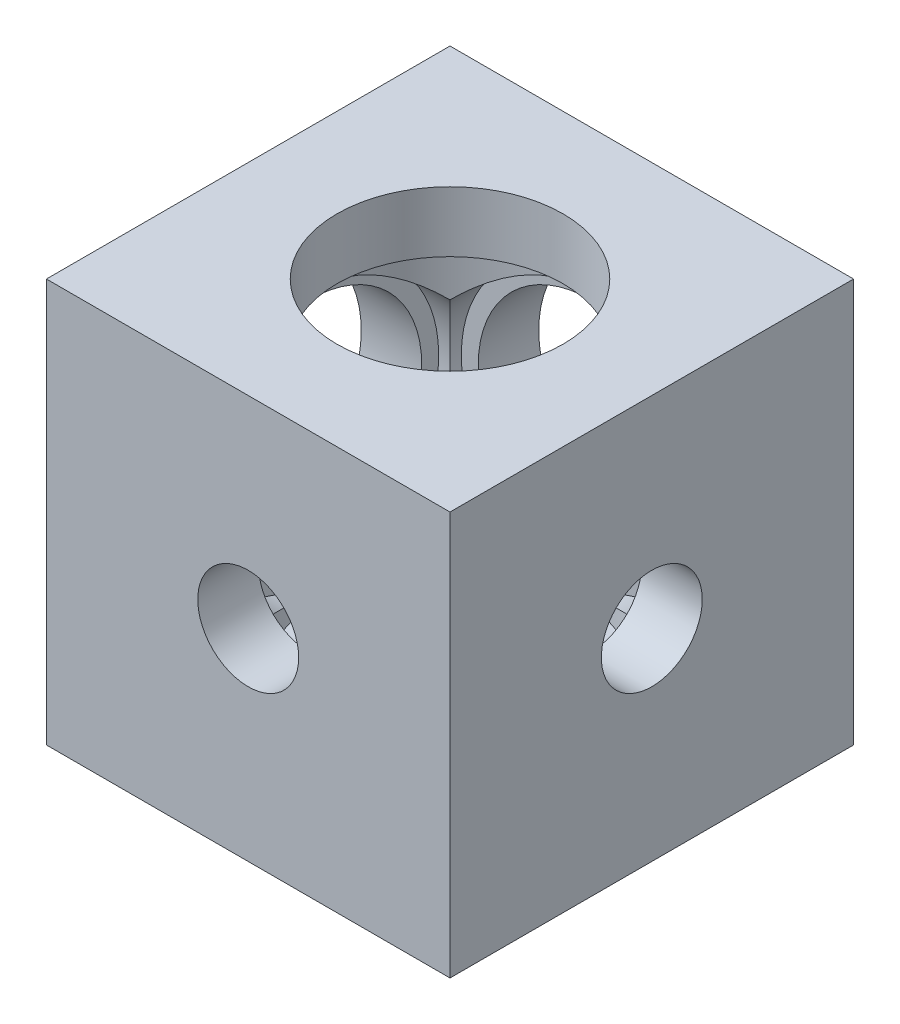
ISO-10303-21;
HEADER;
FILE_DESCRIPTION(('STEP AP214'),'2;1');
FILE_NAME('part.step','',(''),(''),'','','');
FILE_SCHEMA(('AUTOMOTIVE_DESIGN { 1 0 10303 214 1 1 1 1 }'));
ENDSEC;
DATA;
#1=APPLICATION_CONTEXT('core data for automotive mechanical design processes');
#2=APPLICATION_PROTOCOL_DEFINITION('international standard','automotive_design',2000,#1);
#3=PRODUCT_CONTEXT('',#1,'mechanical');
#4=PRODUCT('Part','Part','',(#3));
#5=PRODUCT_RELATED_PRODUCT_CATEGORY('part','',(#4));
#6=PRODUCT_DEFINITION_FORMATION('','',#4);
#7=PRODUCT_DEFINITION_CONTEXT('part definition',#1,'design');
#8=PRODUCT_DEFINITION('design','',#6,#7);
#9=PRODUCT_DEFINITION_SHAPE('','',#8);
#10=(LENGTH_UNIT() NAMED_UNIT(*) SI_UNIT(.MILLI.,.METRE.));
#11=(NAMED_UNIT(*) PLANE_ANGLE_UNIT() SI_UNIT($,.RADIAN.));
#12=(NAMED_UNIT(*) SI_UNIT($,.STERADIAN.) SOLID_ANGLE_UNIT());
#13=UNCERTAINTY_MEASURE_WITH_UNIT(LENGTH_MEASURE(1.E-05),#10,'distance_accuracy_value','');
#14=(GEOMETRIC_REPRESENTATION_CONTEXT(3) GLOBAL_UNCERTAINTY_ASSIGNED_CONTEXT((#13)) GLOBAL_UNIT_ASSIGNED_CONTEXT((#10,
#11,#12)) REPRESENTATION_CONTEXT('',''));
#15=CARTESIAN_POINT('',(0.,0.,0.));
#16=DIRECTION('',(0.,0.,1.));
#17=DIRECTION('',(1.,0.,0.));
#18=AXIS2_PLACEMENT_3D('',#15,#16,#17);
#19=CARTESIAN_POINT('',(0.,20.,0.));
#20=DIRECTION('',(0.,1.,0.));
#21=DIRECTION('',(0.,0.,1.));
#22=AXIS2_PLACEMENT_3D('',#19,#20,#21);
#23=CYLINDRICAL_SURFACE('',#22,6.4389);
#24=CARTESIAN_POINT('',(0.,10.,0.));
#25=DIRECTION('',(0.,0.707106781186548,-0.707106781186548));
#26=DIRECTION('',(0.,0.707106781186548,0.707106781186548));
#27=AXIS2_PLACEMENT_3D('',#24,#25,#26);
#28=ELLIPSE('',#27,9.10597970676411,6.4389);
#29=CARTESIAN_POINT('',(4.55298985338206,5.44701014661794,-4.55298985338206));
#30=VERTEX_POINT('',#29);
#31=CARTESIAN_POINT('',(-4.55298985338206,5.44701014661794,-4.55298985338206));
#32=VERTEX_POINT('',#31);
#33=EDGE_CURVE('E104',#30,#32,#28,.T.);
#34=ORIENTED_EDGE('',*,*,#33,.T.);
#35=CARTESIAN_POINT('',(0.,10.,0.));
#36=DIRECTION('',(-0.707106781186548,0.707106781186548,0.));
#37=DIRECTION('',(0.707106781186548,0.707106781186548,0.));
#38=AXIS2_PLACEMENT_3D('',#35,#36,#37);
#39=ELLIPSE('',#38,9.10597970676412,6.4389);
#40=CARTESIAN_POINT('',(-4.55298985338206,5.44701014661794,4.55298985338206));
#41=VERTEX_POINT('',#40);
#42=EDGE_CURVE('E139',#32,#41,#39,.T.);
#43=ORIENTED_EDGE('',*,*,#42,.T.);
#44=CARTESIAN_POINT('',(0.,10.,0.));
#45=DIRECTION('',(0.,0.707106781186548,0.707106781186548));
#46=DIRECTION('',(0.,0.707106781186548,-0.707106781186548));
#47=AXIS2_PLACEMENT_3D('',#44,#45,#46);
#48=ELLIPSE('',#47,9.10597970676411,6.4389);
#49=CARTESIAN_POINT('',(4.55298985338206,5.44701014661794,4.55298985338206));
#50=VERTEX_POINT('',#49);
#51=EDGE_CURVE('E98',#41,#50,#48,.T.);
#52=ORIENTED_EDGE('',*,*,#51,.T.);
#53=CARTESIAN_POINT('',(0.,10.,0.));
#54=DIRECTION('',(0.707106781186548,0.707106781186548,0.));
#55=DIRECTION('',(-0.707106781186548,0.707106781186548,0.));
#56=AXIS2_PLACEMENT_3D('',#53,#54,#55);
#57=ELLIPSE('',#56,9.10597970676412,6.4389);
#58=EDGE_CURVE('E32',#50,#30,#57,.T.);
#59=ORIENTED_EDGE('',*,*,#58,.T.);
#60=EDGE_LOOP('',(#34,#43,#52,#59));
#61=FACE_BOUND('',#60,.T.);
#62=CARTESIAN_POINT('',(0.,3.,0.));
#63=DIRECTION('',(0.,-1.,0.));
#64=DIRECTION('',(0.,0.,-1.));
#65=AXIS2_PLACEMENT_3D('',#62,#63,#64);
#66=CIRCLE('',#65,6.4389);
#67=CARTESIAN_POINT('',(0.,3.,-6.4389));
#68=VERTEX_POINT('',#67);
#69=EDGE_CURVE('E11',#68,#68,#66,.F.);
#70=ORIENTED_EDGE('',*,*,#69,.F.);
#71=EDGE_LOOP('',(#70));
#72=FACE_BOUND('',#71,.T.);
#73=ADVANCED_FACE('F17',(#61,#72),#23,.F.);
#74=CARTESIAN_POINT('',(-10.,10.,0.));
#75=DIRECTION('',(-1.,0.,0.));
#76=DIRECTION('',(0.,0.,1.));
#77=AXIS2_PLACEMENT_3D('',#74,#75,#76);
#78=CYLINDRICAL_SURFACE('',#77,6.4389);
#79=ORIENTED_EDGE('',*,*,#58,.F.);
#80=CARTESIAN_POINT('',(0.,10.,0.));
#81=DIRECTION('',(0.707106781186548,0.,-0.707106781186548));
#82=DIRECTION('',(-0.707106781186548,0.,-0.707106781186548));
#83=AXIS2_PLACEMENT_3D('',#80,#81,#82);
#84=ELLIPSE('',#83,9.10597970676412,6.4389);
#85=CARTESIAN_POINT('',(4.55298985338206,14.5529898533821,4.55298985338206));
#86=VERTEX_POINT('',#85);
#87=EDGE_CURVE('E140',#86,#50,#84,.T.);
#88=ORIENTED_EDGE('',*,*,#87,.F.);
#89=CARTESIAN_POINT('',(0.,10.,0.));
#90=DIRECTION('',(-0.707106781186548,0.707106781186548,0.));
#91=DIRECTION('',(0.707106781186548,0.707106781186548,0.));
#92=AXIS2_PLACEMENT_3D('',#89,#90,#91);
#93=ELLIPSE('',#92,9.10597970676412,6.4389);
#94=CARTESIAN_POINT('',(4.55298985338206,14.5529898533821,-4.55298985338206));
#95=VERTEX_POINT('',#94);
#96=EDGE_CURVE('E89',#95,#86,#93,.F.);
#97=ORIENTED_EDGE('',*,*,#96,.F.);
#98=CARTESIAN_POINT('',(0.,10.,0.));
#99=DIRECTION('',(-0.707106781186548,0.,-0.707106781186548));
#100=DIRECTION('',(0.707106781186548,0.,-0.707106781186548));
#101=AXIS2_PLACEMENT_3D('',#98,#99,#100);
#102=ELLIPSE('',#101,9.10597970676412,6.4389);
#103=EDGE_CURVE('E146',#30,#95,#102,.F.);
#104=ORIENTED_EDGE('',*,*,#103,.F.);
#105=EDGE_LOOP('',(#79,#88,#97,#104));
#106=FACE_BOUND('',#105,.T.);
#107=CARTESIAN_POINT('',(7.,10.,0.));
#108=DIRECTION('',(1.,0.,0.));
#109=DIRECTION('',(0.,0.,-1.));
#110=AXIS2_PLACEMENT_3D('',#107,#108,#109);
#111=CIRCLE('',#110,6.4389);
#112=CARTESIAN_POINT('',(7.,10.,-6.4389));
#113=VERTEX_POINT('',#112);
#114=EDGE_CURVE('E25',#113,#113,#111,.F.);
#115=ORIENTED_EDGE('',*,*,#114,.F.);
#116=EDGE_LOOP('',(#115));
#117=FACE_BOUND('',#116,.T.);
#118=ADVANCED_FACE('F226',(#106,#117),#78,.F.);
#119=CARTESIAN_POINT('',(0.,10.,-10.));
#120=DIRECTION('',(0.,0.,-1.));
#121=DIRECTION('',(-1.,0.,0.));
#122=AXIS2_PLACEMENT_3D('',#119,#120,#121);
#123=CYLINDRICAL_SURFACE('',#122,6.4389);
#124=ORIENTED_EDGE('',*,*,#51,.F.);
#125=CARTESIAN_POINT('',(0.,10.,0.));
#126=DIRECTION('',(-0.707106781186548,0.,-0.707106781186548));
#127=DIRECTION('',(0.707106781186548,0.,-0.707106781186548));
#128=AXIS2_PLACEMENT_3D('',#125,#126,#127);
#129=ELLIPSE('',#128,9.10597970676412,6.4389);
#130=CARTESIAN_POINT('',(-4.55298985338206,14.5529898533821,4.55298985338206));
#131=VERTEX_POINT('',#130);
#132=EDGE_CURVE('E83',#41,#131,#129,.T.);
#133=ORIENTED_EDGE('',*,*,#132,.T.);
#134=CARTESIAN_POINT('',(0.,10.,0.));
#135=DIRECTION('',(0.,0.707106781186548,-0.707106781186548));
#136=DIRECTION('',(0.,0.707106781186548,0.707106781186548));
#137=AXIS2_PLACEMENT_3D('',#134,#135,#136);
#138=ELLIPSE('',#137,9.10597970676411,6.4389);
#139=EDGE_CURVE('E90',#86,#131,#138,.F.);
#140=ORIENTED_EDGE('',*,*,#139,.F.);
#141=ORIENTED_EDGE('',*,*,#87,.T.);
#142=EDGE_LOOP('',(#124,#133,#140,#141));
#143=FACE_BOUND('',#142,.T.);
#144=CARTESIAN_POINT('',(0.,10.,7.));
#145=DIRECTION('',(0.,0.,1.));
#146=DIRECTION('',(1.,0.,0.));
#147=AXIS2_PLACEMENT_3D('',#144,#145,#146);
#148=CIRCLE('',#147,6.4389);
#149=CARTESIAN_POINT('',(6.4389,10.,7.));
#150=VERTEX_POINT('',#149);
#151=EDGE_CURVE('E460',#150,#150,#148,.F.);
#152=ORIENTED_EDGE('',*,*,#151,.F.);
#153=EDGE_LOOP('',(#152));
#154=FACE_BOUND('',#153,.T.);
#155=ADVANCED_FACE('F95',(#143,#154),#123,.F.);
#156=CARTESIAN_POINT('',(0.,10.,0.));
#157=DIRECTION('',(0.,0.707106781186548,0.707106781186548));
#158=DIRECTION('',(0.,0.707106781186548,-0.707106781186548));
#159=AXIS2_PLACEMENT_3D('',#156,#157,#158);
#160=ELLIPSE('',#159,9.10597970676411,6.4389);
#161=CARTESIAN_POINT('',(-4.55298985338206,14.5529898533821,-4.55298985338206));
#162=VERTEX_POINT('',#161);
#163=EDGE_CURVE('E135',#162,#95,#160,.F.);
#164=ORIENTED_EDGE('',*,*,#163,.T.);
#165=ORIENTED_EDGE('',*,*,#96,.T.);
#166=ORIENTED_EDGE('',*,*,#139,.T.);
#167=CARTESIAN_POINT('',(0.,10.,0.));
#168=DIRECTION('',(0.707106781186548,0.707106781186548,0.));
#169=DIRECTION('',(-0.707106781186548,0.707106781186548,0.));
#170=AXIS2_PLACEMENT_3D('',#167,#168,#169);
#171=ELLIPSE('',#170,9.10597970676412,6.4389);
#172=EDGE_CURVE('E79',#131,#162,#171,.F.);
#173=ORIENTED_EDGE('',*,*,#172,.T.);
#174=EDGE_LOOP('',(#164,#165,#166,#173));
#175=FACE_BOUND('',#174,.T.);
#176=CARTESIAN_POINT('',(0.,17.,0.));
#177=DIRECTION('',(0.,1.,0.));
#178=DIRECTION('',(0.,0.,1.));
#179=AXIS2_PLACEMENT_3D('',#176,#177,#178);
#180=CIRCLE('',#179,6.4389);
#181=CARTESIAN_POINT('',(0.,17.,6.4389));
#182=VERTEX_POINT('',#181);
#183=EDGE_CURVE('E461',#182,#182,#180,.F.);
#184=ORIENTED_EDGE('',*,*,#183,.F.);
#185=EDGE_LOOP('',(#184));
#186=FACE_BOUND('',#185,.T.);
#187=ADVANCED_FACE('F102',(#175,#186),#23,.F.);
#188=ORIENTED_EDGE('',*,*,#33,.F.);
#189=ORIENTED_EDGE('',*,*,#103,.T.);
#190=ORIENTED_EDGE('',*,*,#163,.F.);
#191=CARTESIAN_POINT('',(0.,10.,0.));
#192=DIRECTION('',(0.707106781186548,0.,-0.707106781186548));
#193=DIRECTION('',(-0.707106781186548,0.,-0.707106781186548));
#194=AXIS2_PLACEMENT_3D('',#191,#192,#193);
#195=ELLIPSE('',#194,9.10597970676412,6.4389);
#196=EDGE_CURVE('E40',#162,#32,#195,.F.);
#197=ORIENTED_EDGE('',*,*,#196,.T.);
#198=EDGE_LOOP('',(#188,#189,#190,#197));
#199=FACE_BOUND('',#198,.T.);
#200=CARTESIAN_POINT('',(0.,10.,-7.));
#201=DIRECTION('',(0.,0.,-1.));
#202=DIRECTION('',(-1.,0.,0.));
#203=AXIS2_PLACEMENT_3D('',#200,#201,#202);
#204=CIRCLE('',#203,6.4389);
#205=CARTESIAN_POINT('',(-6.4389,10.,-7.));
#206=VERTEX_POINT('',#205);
#207=EDGE_CURVE('E465',#206,#206,#204,.F.);
#208=ORIENTED_EDGE('',*,*,#207,.F.);
#209=EDGE_LOOP('',(#208));
#210=FACE_BOUND('',#209,.T.);
#211=ADVANCED_FACE('F235',(#199,#210),#123,.F.);
#212=ORIENTED_EDGE('',*,*,#196,.F.);
#213=ORIENTED_EDGE('',*,*,#172,.F.);
#214=ORIENTED_EDGE('',*,*,#132,.F.);
#215=ORIENTED_EDGE('',*,*,#42,.F.);
#216=EDGE_LOOP('',(#212,#213,#214,#215));
#217=FACE_BOUND('',#216,.T.);
#218=CARTESIAN_POINT('',(-7.,10.,0.));
#219=DIRECTION('',(-1.,0.,0.));
#220=DIRECTION('',(0.,0.,1.));
#221=AXIS2_PLACEMENT_3D('',#218,#219,#220);
#222=CIRCLE('',#221,6.4389);
#223=CARTESIAN_POINT('',(-7.,10.,6.4389));
#224=VERTEX_POINT('',#223);
#225=EDGE_CURVE('E111',#224,#224,#222,.F.);
#226=ORIENTED_EDGE('',*,*,#225,.F.);
#227=EDGE_LOOP('',(#226));
#228=FACE_BOUND('',#227,.T.);
#229=ADVANCED_FACE('F81',(#217,#228),#78,.F.);
#230=CARTESIAN_POINT('',(10.,20.,-10.));
#231=DIRECTION('',(-1.,0.,0.));
#232=DIRECTION('',(0.,0.,1.));
#233=AXIS2_PLACEMENT_3D('',#230,#231,#232);
#234=PLANE('',#233);
#235=DIRECTION('',(0.,0.,-1.));
#236=VECTOR('',#235,1.);
#237=CARTESIAN_POINT('',(10.,0.,-10.));
#238=LINE('',#237,#236);
#239=CARTESIAN_POINT('',(10.,0.,10.));
#240=VERTEX_POINT('',#239);
#241=CARTESIAN_POINT('',(10.,0.,-10.));
#242=VERTEX_POINT('',#241);
#243=EDGE_CURVE('E149',#240,#242,#238,.T.);
#244=ORIENTED_EDGE('',*,*,#243,.T.);
#245=DIRECTION('',(0.,-1.,0.));
#246=VECTOR('',#245,1.);
#247=CARTESIAN_POINT('',(10.,20.,-10.));
#248=LINE('',#247,#246);
#249=CARTESIAN_POINT('',(10.,20.,-10.));
#250=VERTEX_POINT('',#249);
#251=EDGE_CURVE('E132',#250,#242,#248,.T.);
#252=ORIENTED_EDGE('',*,*,#251,.F.);
#253=DIRECTION('',(0.,0.,-1.));
#254=VECTOR('',#253,1.);
#255=CARTESIAN_POINT('',(10.,20.,-10.));
#256=LINE('',#255,#254);
#257=CARTESIAN_POINT('',(10.,20.,10.));
#258=VERTEX_POINT('',#257);
#259=EDGE_CURVE('E115',#258,#250,#256,.T.);
#260=ORIENTED_EDGE('',*,*,#259,.F.);
#261=DIRECTION('',(0.,-1.,0.));
#262=VECTOR('',#261,1.);
#263=CARTESIAN_POINT('',(10.,20.,10.));
#264=LINE('',#263,#262);
#265=EDGE_CURVE('E122',#258,#240,#264,.T.);
#266=ORIENTED_EDGE('',*,*,#265,.T.);
#267=EDGE_LOOP('',(#244,#252,#260,#266));
#268=FACE_BOUND('',#267,.T.);
#269=CARTESIAN_POINT('',(10.,10.,0.));
#270=DIRECTION('',(1.,0.,0.));
#271=DIRECTION('',(0.,0.,-1.));
#272=AXIS2_PLACEMENT_3D('',#269,#270,#271);
#273=CIRCLE('',#272,2.5);
#274=CARTESIAN_POINT('',(10.,10.,-2.5));
#275=VERTEX_POINT('',#274);
#276=EDGE_CURVE('E297',#275,#275,#273,.T.);
#277=ORIENTED_EDGE('',*,*,#276,.F.);
#278=EDGE_LOOP('',(#277));
#279=FACE_BOUND('',#278,.T.);
#280=ADVANCED_FACE('F19',(#268,#279),#234,.F.);
#281=CARTESIAN_POINT('',(-10.,20.,10.));
#282=DIRECTION('',(0.,0.,-1.));
#283=DIRECTION('',(-1.,0.,0.));
#284=AXIS2_PLACEMENT_3D('',#281,#282,#283);
#285=PLANE('',#284);
#286=DIRECTION('',(1.,0.,0.));
#287=VECTOR('',#286,1.);
#288=CARTESIAN_POINT('',(-10.,0.,10.));
#289=LINE('',#288,#287);
#290=CARTESIAN_POINT('',(-10.,0.,10.));
#291=VERTEX_POINT('',#290);
#292=EDGE_CURVE('E112',#291,#240,#289,.T.);
#293=ORIENTED_EDGE('',*,*,#292,.T.);
#294=ORIENTED_EDGE('',*,*,#265,.F.);
#295=DIRECTION('',(1.,0.,0.));
#296=VECTOR('',#295,1.);
#297=CARTESIAN_POINT('',(-10.,20.,10.));
#298=LINE('',#297,#296);
#299=CARTESIAN_POINT('',(-10.,20.,10.));
#300=VERTEX_POINT('',#299);
#301=EDGE_CURVE('E126',#300,#258,#298,.T.);
#302=ORIENTED_EDGE('',*,*,#301,.F.);
#303=DIRECTION('',(0.,-1.,0.));
#304=VECTOR('',#303,1.);
#305=CARTESIAN_POINT('',(-10.,20.,10.));
#306=LINE('',#305,#304);
#307=EDGE_CURVE('E125',#300,#291,#306,.T.);
#308=ORIENTED_EDGE('',*,*,#307,.T.);
#309=EDGE_LOOP('',(#293,#294,#302,#308));
#310=FACE_BOUND('',#309,.T.);
#311=CARTESIAN_POINT('',(0.,10.,10.));
#312=DIRECTION('',(0.,0.,1.));
#313=DIRECTION('',(1.,0.,0.));
#314=AXIS2_PLACEMENT_3D('',#311,#312,#313);
#315=CIRCLE('',#314,2.5);
#316=CARTESIAN_POINT('',(2.5,10.,10.));
#317=VERTEX_POINT('',#316);
#318=EDGE_CURVE('E303',#317,#317,#315,.T.);
#319=ORIENTED_EDGE('',*,*,#318,.F.);
#320=EDGE_LOOP('',(#319));
#321=FACE_BOUND('',#320,.T.);
#322=ADVANCED_FACE('F171',(#310,#321),#285,.F.);
#323=CARTESIAN_POINT('',(0.,0.,0.));
#324=DIRECTION('',(0.,1.,0.));
#325=DIRECTION('',(0.,0.,1.));
#326=AXIS2_PLACEMENT_3D('',#323,#324,#325);
#327=PLANE('',#326);
#328=DIRECTION('',(-1.,0.,0.));
#329=VECTOR('',#328,1.);
#330=CARTESIAN_POINT('',(-10.,0.,-10.));
#331=LINE('',#330,#329);
#332=CARTESIAN_POINT('',(-10.,0.,-10.));
#333=VERTEX_POINT('',#332);
#334=EDGE_CURVE('E157',#242,#333,#331,.T.);
#335=ORIENTED_EDGE('',*,*,#334,.F.);
#336=ORIENTED_EDGE('',*,*,#243,.F.);
#337=ORIENTED_EDGE('',*,*,#292,.F.);
#338=DIRECTION('',(0.,0.,1.));
#339=VECTOR('',#338,1.);
#340=CARTESIAN_POINT('',(-10.,0.,-10.));
#341=LINE('',#340,#339);
#342=EDGE_CURVE('E116',#333,#291,#341,.T.);
#343=ORIENTED_EDGE('',*,*,#342,.F.);
#344=EDGE_LOOP('',(#335,#336,#337,#343));
#345=FACE_BOUND('',#344,.T.);
#346=CARTESIAN_POINT('',(0.,0.,0.));
#347=DIRECTION('',(0.,-1.,0.));
#348=DIRECTION('',(0.,0.,-1.));
#349=AXIS2_PLACEMENT_3D('',#346,#347,#348);
#350=CIRCLE('',#349,2.5);
#351=CARTESIAN_POINT('',(0.,0.,-2.5));
#352=VERTEX_POINT('',#351);
#353=EDGE_CURVE('E295',#352,#352,#350,.T.);
#354=ORIENTED_EDGE('',*,*,#353,.F.);
#355=EDGE_LOOP('',(#354));
#356=FACE_BOUND('',#355,.T.);
#357=ADVANCED_FACE('F175',(#345,#356),#327,.F.);
#358=CARTESIAN_POINT('',(-10.,20.,-10.));
#359=DIRECTION('',(0.,0.,1.));
#360=DIRECTION('',(1.,0.,0.));
#361=AXIS2_PLACEMENT_3D('',#358,#359,#360);
#362=PLANE('',#361);
#363=ORIENTED_EDGE('',*,*,#334,.T.);
#364=DIRECTION('',(0.,-1.,0.));
#365=VECTOR('',#364,1.);
#366=CARTESIAN_POINT('',(-10.,20.,-10.));
#367=LINE('',#366,#365);
#368=CARTESIAN_POINT('',(-10.,20.,-10.));
#369=VERTEX_POINT('',#368);
#370=EDGE_CURVE('E129',#369,#333,#367,.T.);
#371=ORIENTED_EDGE('',*,*,#370,.F.);
#372=DIRECTION('',(-1.,0.,0.));
#373=VECTOR('',#372,1.);
#374=CARTESIAN_POINT('',(-10.,20.,-10.));
#375=LINE('',#374,#373);
#376=EDGE_CURVE('E152',#250,#369,#375,.T.);
#377=ORIENTED_EDGE('',*,*,#376,.F.);
#378=ORIENTED_EDGE('',*,*,#251,.T.);
#379=EDGE_LOOP('',(#363,#371,#377,#378));
#380=FACE_BOUND('',#379,.T.);
#381=CARTESIAN_POINT('',(0.,10.,-10.));
#382=DIRECTION('',(0.,0.,-1.));
#383=DIRECTION('',(-1.,0.,0.));
#384=AXIS2_PLACEMENT_3D('',#381,#382,#383);
#385=CIRCLE('',#384,5.6);
#386=CARTESIAN_POINT('',(-5.6,10.,-10.));
#387=VERTEX_POINT('',#386);
#388=EDGE_CURVE('E189',#387,#387,#385,.T.);
#389=ORIENTED_EDGE('',*,*,#388,.F.);
#390=EDGE_LOOP('',(#389));
#391=FACE_BOUND('',#390,.T.);
#392=ADVANCED_FACE('F184',(#380,#391),#362,.F.);
#393=CARTESIAN_POINT('',(-10.,20.,-10.));
#394=DIRECTION('',(1.,0.,0.));
#395=DIRECTION('',(0.,0.,-1.));
#396=AXIS2_PLACEMENT_3D('',#393,#394,#395);
#397=PLANE('',#396);
#398=ORIENTED_EDGE('',*,*,#342,.T.);
#399=ORIENTED_EDGE('',*,*,#307,.F.);
#400=DIRECTION('',(0.,0.,1.));
#401=VECTOR('',#400,1.);
#402=CARTESIAN_POINT('',(-10.,20.,-10.));
#403=LINE('',#402,#401);
#404=EDGE_CURVE('E154',#369,#300,#403,.T.);
#405=ORIENTED_EDGE('',*,*,#404,.F.);
#406=ORIENTED_EDGE('',*,*,#370,.T.);
#407=EDGE_LOOP('',(#398,#399,#405,#406));
#408=FACE_BOUND('',#407,.T.);
#409=CARTESIAN_POINT('',(-10.,10.,0.));
#410=DIRECTION('',(-1.,0.,0.));
#411=DIRECTION('',(0.,0.,1.));
#412=AXIS2_PLACEMENT_3D('',#409,#410,#411);
#413=CIRCLE('',#412,5.6);
#414=CARTESIAN_POINT('',(-10.,10.,5.6));
#415=VERTEX_POINT('',#414);
#416=EDGE_CURVE('E99',#415,#415,#413,.T.);
#417=ORIENTED_EDGE('',*,*,#416,.F.);
#418=EDGE_LOOP('',(#417));
#419=FACE_BOUND('',#418,.T.);
#420=ADVANCED_FACE('F164',(#408,#419),#397,.F.);
#421=CARTESIAN_POINT('',(0.,20.,0.));
#422=DIRECTION('',(0.,1.,0.));
#423=DIRECTION('',(0.,0.,1.));
#424=AXIS2_PLACEMENT_3D('',#421,#422,#423);
#425=PLANE('',#424);
#426=ORIENTED_EDGE('',*,*,#259,.T.);
#427=ORIENTED_EDGE('',*,*,#376,.T.);
#428=ORIENTED_EDGE('',*,*,#404,.T.);
#429=ORIENTED_EDGE('',*,*,#301,.T.);
#430=EDGE_LOOP('',(#426,#427,#428,#429));
#431=FACE_BOUND('',#430,.T.);
#432=CARTESIAN_POINT('',(0.,20.,0.));
#433=DIRECTION('',(0.,1.,0.));
#434=DIRECTION('',(0.,0.,1.));
#435=AXIS2_PLACEMENT_3D('',#432,#433,#434);
#436=CIRCLE('',#435,5.6);
#437=CARTESIAN_POINT('',(0.,20.,5.6));
#438=VERTEX_POINT('',#437);
#439=EDGE_CURVE('E198',#438,#438,#436,.T.);
#440=ORIENTED_EDGE('',*,*,#439,.F.);
#441=EDGE_LOOP('',(#440));
#442=FACE_BOUND('',#441,.T.);
#443=ADVANCED_FACE('F182',(#431,#442),#425,.T.);
#444=CARTESIAN_POINT('',(-7.,10.,0.));
#445=DIRECTION('',(-1.,0.,0.));
#446=DIRECTION('',(0.,0.,1.));
#447=AXIS2_PLACEMENT_3D('',#444,#445,#446);
#448=PLANE('',#447);
#449=CARTESIAN_POINT('',(-7.,10.,0.));
#450=DIRECTION('',(-1.,0.,0.));
#451=DIRECTION('',(0.,0.,1.));
#452=AXIS2_PLACEMENT_3D('',#449,#450,#451);
#453=CIRCLE('',#452,5.6);
#454=CARTESIAN_POINT('',(-7.,10.,5.6));
#455=VERTEX_POINT('',#454);
#456=EDGE_CURVE('E195',#455,#455,#453,.T.);
#457=ORIENTED_EDGE('',*,*,#456,.T.);
#458=EDGE_LOOP('',(#457));
#459=FACE_BOUND('',#458,.T.);
#460=ORIENTED_EDGE('',*,*,#225,.T.);
#461=EDGE_LOOP('',(#460));
#462=FACE_BOUND('',#461,.T.);
#463=ADVANCED_FACE('F207',(#459,#462),#448,.F.);
#464=CARTESIAN_POINT('',(-7.,10.,0.));
#465=DIRECTION('',(-1.,0.,0.));
#466=DIRECTION('',(0.,0.,1.));
#467=AXIS2_PLACEMENT_3D('',#464,#465,#466);
#468=CYLINDRICAL_SURFACE('',#467,5.6);
#469=ORIENTED_EDGE('',*,*,#456,.F.);
#470=EDGE_LOOP('',(#469));
#471=FACE_BOUND('',#470,.T.);
#472=ORIENTED_EDGE('',*,*,#416,.T.);
#473=EDGE_LOOP('',(#472));
#474=FACE_BOUND('',#473,.T.);
#475=ADVANCED_FACE('F210',(#471,#474),#468,.F.);
#476=CARTESIAN_POINT('',(0.,10.,-7.));
#477=DIRECTION('',(0.,0.,-1.));
#478=DIRECTION('',(-1.,0.,0.));
#479=AXIS2_PLACEMENT_3D('',#476,#477,#478);
#480=PLANE('',#479);
#481=CARTESIAN_POINT('',(0.,10.,-7.));
#482=DIRECTION('',(0.,0.,-1.));
#483=DIRECTION('',(-1.,0.,0.));
#484=AXIS2_PLACEMENT_3D('',#481,#482,#483);
#485=CIRCLE('',#484,5.6);
#486=CARTESIAN_POINT('',(-5.6,10.,-7.));
#487=VERTEX_POINT('',#486);
#488=EDGE_CURVE('E191',#487,#487,#485,.T.);
#489=ORIENTED_EDGE('',*,*,#488,.T.);
#490=EDGE_LOOP('',(#489));
#491=FACE_BOUND('',#490,.T.);
#492=ORIENTED_EDGE('',*,*,#207,.T.);
#493=EDGE_LOOP('',(#492));
#494=FACE_BOUND('',#493,.T.);
#495=ADVANCED_FACE('F213',(#491,#494),#480,.F.);
#496=CARTESIAN_POINT('',(0.,10.,-7.));
#497=DIRECTION('',(0.,0.,-1.));
#498=DIRECTION('',(-1.,0.,0.));
#499=AXIS2_PLACEMENT_3D('',#496,#497,#498);
#500=CYLINDRICAL_SURFACE('',#499,5.6);
#501=ORIENTED_EDGE('',*,*,#488,.F.);
#502=EDGE_LOOP('',(#501));
#503=FACE_BOUND('',#502,.T.);
#504=ORIENTED_EDGE('',*,*,#388,.T.);
#505=EDGE_LOOP('',(#504));
#506=FACE_BOUND('',#505,.T.);
#507=ADVANCED_FACE('F250',(#503,#506),#500,.F.);
#508=CARTESIAN_POINT('',(0.,17.,0.));
#509=DIRECTION('',(0.,1.,0.));
#510=DIRECTION('',(0.,0.,1.));
#511=AXIS2_PLACEMENT_3D('',#508,#509,#510);
#512=PLANE('',#511);
#513=CARTESIAN_POINT('',(0.,17.,0.));
#514=DIRECTION('',(0.,1.,0.));
#515=DIRECTION('',(0.,0.,1.));
#516=AXIS2_PLACEMENT_3D('',#513,#514,#515);
#517=CIRCLE('',#516,5.6);
#518=CARTESIAN_POINT('',(0.,17.,5.6));
#519=VERTEX_POINT('',#518);
#520=EDGE_CURVE('E192',#519,#519,#517,.T.);
#521=ORIENTED_EDGE('',*,*,#520,.T.);
#522=EDGE_LOOP('',(#521));
#523=FACE_BOUND('',#522,.T.);
#524=ORIENTED_EDGE('',*,*,#183,.T.);
#525=EDGE_LOOP('',(#524));
#526=FACE_BOUND('',#525,.T.);
#527=ADVANCED_FACE('F254',(#523,#526),#512,.F.);
#528=CARTESIAN_POINT('',(0.,17.,0.));
#529=DIRECTION('',(0.,1.,0.));
#530=DIRECTION('',(0.,0.,1.));
#531=AXIS2_PLACEMENT_3D('',#528,#529,#530);
#532=CYLINDRICAL_SURFACE('',#531,5.6);
#533=ORIENTED_EDGE('',*,*,#520,.F.);
#534=EDGE_LOOP('',(#533));
#535=FACE_BOUND('',#534,.T.);
#536=ORIENTED_EDGE('',*,*,#439,.T.);
#537=EDGE_LOOP('',(#536));
#538=FACE_BOUND('',#537,.T.);
#539=ADVANCED_FACE('F258',(#535,#538),#532,.F.);
#540=CARTESIAN_POINT('',(0.,10.,7.));
#541=DIRECTION('',(0.,0.,1.));
#542=DIRECTION('',(1.,0.,0.));
#543=AXIS2_PLACEMENT_3D('',#540,#541,#542);
#544=PLANE('',#543);
#545=CARTESIAN_POINT('',(0.,10.,7.));
#546=DIRECTION('',(0.,0.,1.));
#547=DIRECTION('',(1.,0.,0.));
#548=AXIS2_PLACEMENT_3D('',#545,#546,#547);
#549=CIRCLE('',#548,2.5);
#550=CARTESIAN_POINT('',(2.5,10.,7.));
#551=VERTEX_POINT('',#550);
#552=EDGE_CURVE('E306',#551,#551,#549,.T.);
#553=ORIENTED_EDGE('',*,*,#552,.T.);
#554=EDGE_LOOP('',(#553));
#555=FACE_BOUND('',#554,.T.);
#556=ORIENTED_EDGE('',*,*,#151,.T.);
#557=EDGE_LOOP('',(#556));
#558=FACE_BOUND('',#557,.T.);
#559=ADVANCED_FACE('F262',(#555,#558),#544,.F.);
#560=CARTESIAN_POINT('',(0.,10.,7.));
#561=DIRECTION('',(0.,0.,1.));
#562=DIRECTION('',(1.,0.,0.));
#563=AXIS2_PLACEMENT_3D('',#560,#561,#562);
#564=CYLINDRICAL_SURFACE('',#563,2.5);
#565=ORIENTED_EDGE('',*,*,#552,.F.);
#566=EDGE_LOOP('',(#565));
#567=FACE_BOUND('',#566,.T.);
#568=ORIENTED_EDGE('',*,*,#318,.T.);
#569=EDGE_LOOP('',(#568));
#570=FACE_BOUND('',#569,.T.);
#571=ADVANCED_FACE('F266',(#567,#570),#564,.F.);
#572=CARTESIAN_POINT('',(7.,10.,0.));
#573=DIRECTION('',(1.,0.,0.));
#574=DIRECTION('',(0.,0.,-1.));
#575=AXIS2_PLACEMENT_3D('',#572,#573,#574);
#576=PLANE('',#575);
#577=CARTESIAN_POINT('',(7.,10.,0.));
#578=DIRECTION('',(1.,0.,0.));
#579=DIRECTION('',(0.,0.,-1.));
#580=AXIS2_PLACEMENT_3D('',#577,#578,#579);
#581=CIRCLE('',#580,2.5);
#582=CARTESIAN_POINT('',(7.,10.,-2.5));
#583=VERTEX_POINT('',#582);
#584=EDGE_CURVE('E300',#583,#583,#581,.T.);
#585=ORIENTED_EDGE('',*,*,#584,.T.);
#586=EDGE_LOOP('',(#585));
#587=FACE_BOUND('',#586,.T.);
#588=ORIENTED_EDGE('',*,*,#114,.T.);
#589=EDGE_LOOP('',(#588));
#590=FACE_BOUND('',#589,.T.);
#591=ADVANCED_FACE('F270',(#587,#590),#576,.F.);
#592=CARTESIAN_POINT('',(7.,10.,0.));
#593=DIRECTION('',(1.,0.,0.));
#594=DIRECTION('',(0.,0.,-1.));
#595=AXIS2_PLACEMENT_3D('',#592,#593,#594);
#596=CYLINDRICAL_SURFACE('',#595,2.5);
#597=ORIENTED_EDGE('',*,*,#584,.F.);
#598=EDGE_LOOP('',(#597));
#599=FACE_BOUND('',#598,.T.);
#600=ORIENTED_EDGE('',*,*,#276,.T.);
#601=EDGE_LOOP('',(#600));
#602=FACE_BOUND('',#601,.T.);
#603=ADVANCED_FACE('F274',(#599,#602),#596,.F.);
#604=CARTESIAN_POINT('',(0.,3.,0.));
#605=DIRECTION('',(0.,-1.,0.));
#606=DIRECTION('',(0.,0.,-1.));
#607=AXIS2_PLACEMENT_3D('',#604,#605,#606);
#608=PLANE('',#607);
#609=CARTESIAN_POINT('',(0.,3.,0.));
#610=DIRECTION('',(0.,-1.,0.));
#611=DIRECTION('',(0.,0.,-1.));
#612=AXIS2_PLACEMENT_3D('',#609,#610,#611);
#613=CIRCLE('',#612,2.5);
#614=CARTESIAN_POINT('',(0.,3.,-2.5));
#615=VERTEX_POINT('',#614);
#616=EDGE_CURVE('E292',#615,#615,#613,.T.);
#617=ORIENTED_EDGE('',*,*,#616,.T.);
#618=EDGE_LOOP('',(#617));
#619=FACE_BOUND('',#618,.T.);
#620=ORIENTED_EDGE('',*,*,#69,.T.);
#621=EDGE_LOOP('',(#620));
#622=FACE_BOUND('',#621,.T.);
#623=ADVANCED_FACE('F278',(#619,#622),#608,.F.);
#624=CARTESIAN_POINT('',(0.,3.,0.));
#625=DIRECTION('',(0.,-1.,0.));
#626=DIRECTION('',(0.,0.,-1.));
#627=AXIS2_PLACEMENT_3D('',#624,#625,#626);
#628=CYLINDRICAL_SURFACE('',#627,2.5);
#629=ORIENTED_EDGE('',*,*,#616,.F.);
#630=EDGE_LOOP('',(#629));
#631=FACE_BOUND('',#630,.T.);
#632=ORIENTED_EDGE('',*,*,#353,.T.);
#633=EDGE_LOOP('',(#632));
#634=FACE_BOUND('',#633,.T.);
#635=ADVANCED_FACE('F282',(#631,#634),#628,.F.);
#636=CLOSED_SHELL('',(#73,#118,#155,#187,#211,#229,#280,#322,#357,#392,#420,#443,#463,#475,#495,
#507,#527,#539,#559,#571,#591,#603,#623,#635));
#637=MANIFOLD_SOLID_BREP('B1',#636);
#638=ADVANCED_BREP_SHAPE_REPRESENTATION('',(#18,#637),#14);
#639=SHAPE_DEFINITION_REPRESENTATION(#9,#638);
ENDSEC;
END-ISO-10303-21;
